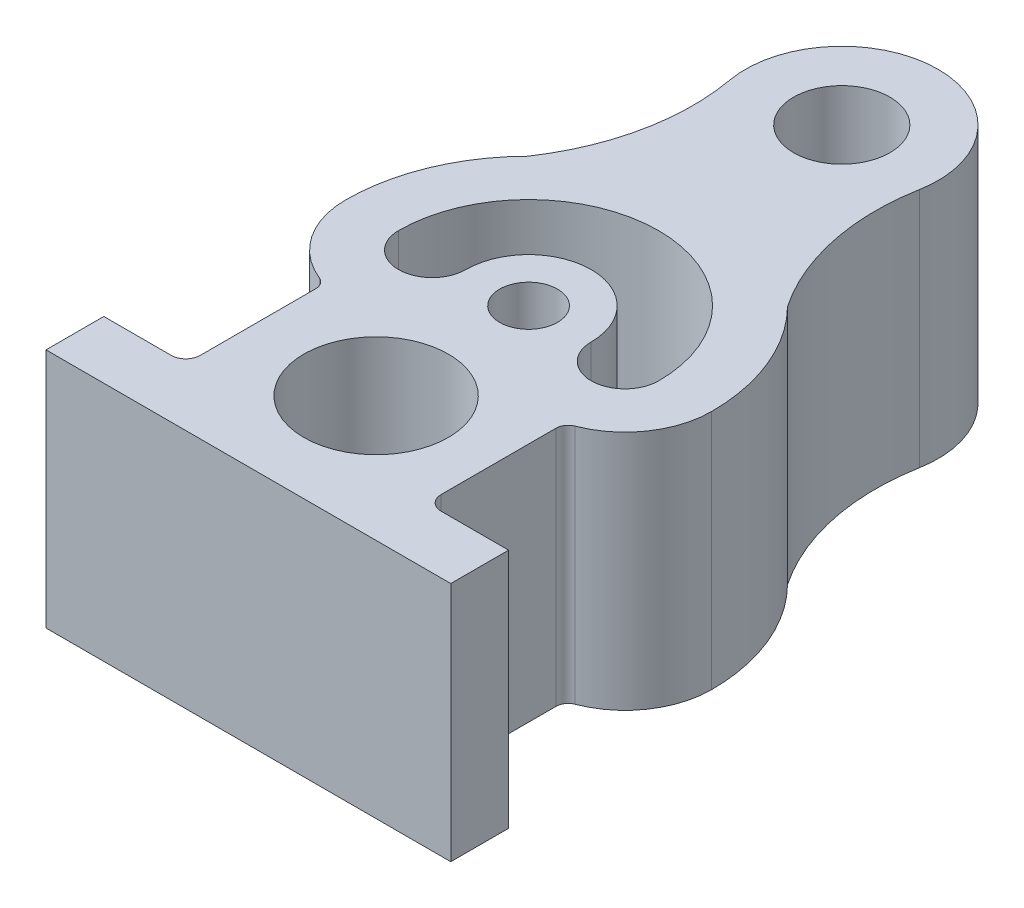
ISO-10303-21;
HEADER;
FILE_DESCRIPTION(('STEP AP214'),'2;1');
FILE_NAME('part.step','',(''),(''),'','','');
FILE_SCHEMA(('AUTOMOTIVE_DESIGN { 1 0 10303 214 1 1 1 1 }'));
ENDSEC;
DATA;
#1=APPLICATION_CONTEXT('core data for automotive mechanical design processes');
#2=APPLICATION_PROTOCOL_DEFINITION('international standard','automotive_design',2000,#1);
#3=PRODUCT_CONTEXT('',#1,'mechanical');
#4=PRODUCT('Part','Part','',(#3));
#5=PRODUCT_RELATED_PRODUCT_CATEGORY('part','',(#4));
#6=PRODUCT_DEFINITION_FORMATION('','',#4);
#7=PRODUCT_DEFINITION_CONTEXT('part definition',#1,'design');
#8=PRODUCT_DEFINITION('design','',#6,#7);
#9=PRODUCT_DEFINITION_SHAPE('','',#8);
#10=(LENGTH_UNIT() NAMED_UNIT(*) SI_UNIT(.MILLI.,.METRE.));
#11=(NAMED_UNIT(*) PLANE_ANGLE_UNIT() SI_UNIT($,.RADIAN.));
#12=(NAMED_UNIT(*) SI_UNIT($,.STERADIAN.) SOLID_ANGLE_UNIT());
#13=UNCERTAINTY_MEASURE_WITH_UNIT(LENGTH_MEASURE(1.E-05),#10,'distance_accuracy_value','');
#14=(GEOMETRIC_REPRESENTATION_CONTEXT(3) GLOBAL_UNCERTAINTY_ASSIGNED_CONTEXT((#13)) GLOBAL_UNIT_ASSIGNED_CONTEXT((#10,
#11,#12)) REPRESENTATION_CONTEXT('',''));
#15=CARTESIAN_POINT('',(0.,0.,0.));
#16=DIRECTION('',(0.,0.,1.));
#17=DIRECTION('',(1.,0.,0.));
#18=AXIS2_PLACEMENT_3D('',#15,#16,#17);
#19=CARTESIAN_POINT('',(0.,100.,0.));
#20=DIRECTION('',(0.,1.,0.));
#21=DIRECTION('',(0.,0.,1.));
#22=AXIS2_PLACEMENT_3D('',#19,#20,#21);
#23=PLANE('',#22);
#24=CARTESIAN_POINT('',(0.,100.,0.));
#25=DIRECTION('',(0.,1.,0.));
#26=DIRECTION('',(0.,0.,1.));
#27=AXIS2_PLACEMENT_3D('',#24,#25,#26);
#28=CIRCLE('',#27,12.);
#29=CARTESIAN_POINT('',(0.,100.,12.));
#30=VERTEX_POINT('',#29);
#31=EDGE_CURVE('E308',#30,#30,#28,.T.);
#32=ORIENTED_EDGE('',*,*,#31,.F.);
#33=EDGE_LOOP('',(#32));
#34=FACE_BOUND('',#33,.T.);
#35=CARTESIAN_POINT('',(-40.,100.,0.));
#36=DIRECTION('',(0.,1.,0.));
#37=DIRECTION('',(0.,0.,1.));
#38=AXIS2_PLACEMENT_3D('',#35,#36,#37);
#39=CIRCLE('',#38,14.);
#40=CARTESIAN_POINT('',(-54.,100.,0.));
#41=VERTEX_POINT('',#40);
#42=CARTESIAN_POINT('',(-26.,100.,0.));
#43=VERTEX_POINT('',#42);
#44=EDGE_CURVE('E201',#41,#43,#39,.T.);
#45=ORIENTED_EDGE('',*,*,#44,.F.);
#46=CARTESIAN_POINT('',(0.,100.,0.));
#47=DIRECTION('',(0.,1.,0.));
#48=DIRECTION('',(0.,0.,1.));
#49=AXIS2_PLACEMENT_3D('',#46,#47,#48);
#50=CIRCLE('',#49,54.);
#51=CARTESIAN_POINT('',(54.,100.,0.));
#52=VERTEX_POINT('',#51);
#53=EDGE_CURVE('E193',#52,#41,#50,.T.);
#54=ORIENTED_EDGE('',*,*,#53,.F.);
#55=CARTESIAN_POINT('',(40.,100.,0.));
#56=DIRECTION('',(0.,1.,0.));
#57=DIRECTION('',(0.,0.,1.));
#58=AXIS2_PLACEMENT_3D('',#55,#56,#57);
#59=CIRCLE('',#58,14.);
#60=CARTESIAN_POINT('',(26.,100.,0.));
#61=VERTEX_POINT('',#60);
#62=EDGE_CURVE('E220',#61,#52,#59,.T.);
#63=ORIENTED_EDGE('',*,*,#62,.F.);
#64=CARTESIAN_POINT('',(0.,100.,0.));
#65=DIRECTION('',(0.,-1.,0.));
#66=DIRECTION('',(0.,0.,1.));
#67=AXIS2_PLACEMENT_3D('',#64,#65,#66);
#68=CIRCLE('',#67,26.);
#69=EDGE_CURVE('E214',#43,#61,#68,.T.);
#70=ORIENTED_EDGE('',*,*,#69,.F.);
#71=EDGE_LOOP('',(#45,#54,#63,#70));
#72=FACE_BOUND('',#71,.T.);
#73=CARTESIAN_POINT('',(0.,100.,0.));
#74=DIRECTION('',(0.,1.,0.));
#75=DIRECTION('',(0.,0.,1.));
#76=AXIS2_PLACEMENT_3D('',#73,#74,#75);
#77=CIRCLE('',#76,76.);
#78=CARTESIAN_POINT('',(76.,100.,0.));
#79=VERTEX_POINT('',#78);
#80=CARTESIAN_POINT('',(54.,100.,-53.4789678284838));
#81=VERTEX_POINT('',#80);
#82=EDGE_CURVE('E838',#79,#81,#77,.T.);
#83=ORIENTED_EDGE('',*,*,#82,.T.);
#84=CARTESIAN_POINT('',(131.859787436224,100.,-106.146353375766));
#85=DIRECTION('',(0.,-1.,0.));
#86=DIRECTION('',(0.,0.,1.));
#87=AXIS2_PLACEMENT_3D('',#84,#85,#86);
#88=CIRCLE('',#87,94.0000000000001);
#89=CARTESIAN_POINT('',(39.3611305779773,100.,-122.879508470378));
#90=VERTEX_POINT('',#89);
#91=EDGE_CURVE('E586',#81,#90,#88,.T.);
#92=ORIENTED_EDGE('',*,*,#91,.T.);
#93=CARTESIAN_POINT('',(0.,100.,-130.));
#94=DIRECTION('',(0.,1.,0.));
#95=DIRECTION('',(0.,0.,1.));
#96=AXIS2_PLACEMENT_3D('',#93,#94,#95);
#97=CIRCLE('',#96,40.);
#98=CARTESIAN_POINT('',(-39.3611305779773,100.,-122.879508470378));
#99=VERTEX_POINT('',#98);
#100=EDGE_CURVE('E442',#90,#99,#97,.T.);
#101=ORIENTED_EDGE('',*,*,#100,.T.);
#102=CARTESIAN_POINT('',(-131.859787436224,100.,-106.146353375766));
#103=DIRECTION('',(0.,-1.,0.));
#104=DIRECTION('',(0.,0.,-1.));
#105=AXIS2_PLACEMENT_3D('',#102,#103,#104);
#106=CIRCLE('',#105,94.);
#107=CARTESIAN_POINT('',(-54.,100.,-53.4789678284838));
#108=VERTEX_POINT('',#107);
#109=EDGE_CURVE('E580',#99,#108,#106,.T.);
#110=ORIENTED_EDGE('',*,*,#109,.T.);
#111=CARTESIAN_POINT('',(0.,100.,0.));
#112=DIRECTION('',(0.,1.,0.));
#113=DIRECTION('',(0.,0.,1.));
#114=AXIS2_PLACEMENT_3D('',#111,#112,#113);
#115=CIRCLE('',#114,76.);
#116=CARTESIAN_POINT('',(-76.,100.,0.));
#117=VERTEX_POINT('',#116);
#118=EDGE_CURVE('E582',#108,#117,#115,.T.);
#119=ORIENTED_EDGE('',*,*,#118,.T.);
#120=CARTESIAN_POINT('',(-40.,100.,0.));
#121=DIRECTION('',(0.,1.,0.));
#122=DIRECTION('',(0.,0.,1.));
#123=AXIS2_PLACEMENT_3D('',#120,#121,#122);
#124=CIRCLE('',#123,36.);
#125=CARTESIAN_POINT('',(-53.4280868087204,100.,33.4018934292275));
#126=VERTEX_POINT('',#125);
#127=EDGE_CURVE('E584',#117,#126,#124,.T.);
#128=ORIENTED_EDGE('',*,*,#127,.T.);
#129=CARTESIAN_POINT('',(-55.2930988654871,100.,38.0410452943979));
#130=DIRECTION('',(0.,-1.,0.));
#131=DIRECTION('',(0.,0.,1.));
#132=AXIS2_PLACEMENT_3D('',#129,#130,#131);
#133=CIRCLE('',#132,5.);
#134=CARTESIAN_POINT('',(-50.2930988654871,100.,38.0410452943979));
#135=VERTEX_POINT('',#134);
#136=EDGE_CURVE('E606',#126,#135,#133,.T.);
#137=ORIENTED_EDGE('',*,*,#136,.T.);
#138=DIRECTION('',(0.,0.,1.));
#139=VECTOR('',#138,1.);
#140=CARTESIAN_POINT('',(-50.2930988654871,100.,86.));
#141=LINE('',#140,#139);
#142=CARTESIAN_POINT('',(-50.2930988654871,100.,86.));
#143=VERTEX_POINT('',#142);
#144=EDGE_CURVE('E616',#135,#143,#141,.T.);
#145=ORIENTED_EDGE('',*,*,#144,.T.);
#146=CARTESIAN_POINT('',(-56.2930988654871,100.,86.));
#147=DIRECTION('',(0.,-1.,0.));
#148=DIRECTION('',(0.,0.,1.));
#149=AXIS2_PLACEMENT_3D('',#146,#147,#148);
#150=CIRCLE('',#149,5.99999999999999);
#151=CARTESIAN_POINT('',(-56.2930988654871,100.,92.));
#152=VERTEX_POINT('',#151);
#153=EDGE_CURVE('E618',#143,#152,#150,.T.);
#154=ORIENTED_EDGE('',*,*,#153,.T.);
#155=DIRECTION('',(-1.,0.,0.));
#156=VECTOR('',#155,1.);
#157=CARTESIAN_POINT('',(-84.2930988654871,100.,92.));
#158=LINE('',#157,#156);
#159=CARTESIAN_POINT('',(-84.2930988654871,100.,92.));
#160=VERTEX_POINT('',#159);
#161=EDGE_CURVE('E627',#152,#160,#158,.T.);
#162=ORIENTED_EDGE('',*,*,#161,.T.);
#163=DIRECTION('',(0.,0.,1.));
#164=VECTOR('',#163,1.);
#165=CARTESIAN_POINT('',(-84.2930988654871,100.,116.));
#166=LINE('',#165,#164);
#167=CARTESIAN_POINT('',(-84.2930988654871,100.,116.));
#168=VERTEX_POINT('',#167);
#169=EDGE_CURVE('E631',#160,#168,#166,.T.);
#170=ORIENTED_EDGE('',*,*,#169,.T.);
#171=DIRECTION('',(1.,0.,0.));
#172=VECTOR('',#171,1.);
#173=CARTESIAN_POINT('',(-84.2930988654871,100.,116.));
#174=LINE('',#173,#172);
#175=CARTESIAN_POINT('',(83.7069011345129,100.,116.));
#176=VERTEX_POINT('',#175);
#177=EDGE_CURVE('E984',#168,#176,#174,.T.);
#178=ORIENTED_EDGE('',*,*,#177,.T.);
#179=DIRECTION('',(0.,0.,-1.));
#180=VECTOR('',#179,1.);
#181=CARTESIAN_POINT('',(83.7069011345129,100.,92.));
#182=LINE('',#181,#180);
#183=CARTESIAN_POINT('',(83.7069011345129,100.,92.));
#184=VERTEX_POINT('',#183);
#185=EDGE_CURVE('E645',#176,#184,#182,.T.);
#186=ORIENTED_EDGE('',*,*,#185,.T.);
#187=DIRECTION('',(-1.,0.,0.));
#188=VECTOR('',#187,1.);
#189=CARTESIAN_POINT('',(83.7069011345129,100.,92.));
#190=LINE('',#189,#188);
#191=CARTESIAN_POINT('',(55.7069011345129,100.,92.));
#192=VERTEX_POINT('',#191);
#193=EDGE_CURVE('E640',#184,#192,#190,.T.);
#194=ORIENTED_EDGE('',*,*,#193,.T.);
#195=CARTESIAN_POINT('',(55.7069011345129,100.,86.));
#196=DIRECTION('',(0.,-1.,0.));
#197=DIRECTION('',(0.,0.,1.));
#198=AXIS2_PLACEMENT_3D('',#195,#196,#197);
#199=CIRCLE('',#198,6.);
#200=CARTESIAN_POINT('',(49.7069011345129,100.,86.));
#201=VERTEX_POINT('',#200);
#202=EDGE_CURVE('E644',#192,#201,#199,.T.);
#203=ORIENTED_EDGE('',*,*,#202,.T.);
#204=DIRECTION('',(0.,0.,-1.));
#205=VECTOR('',#204,1.);
#206=CARTESIAN_POINT('',(49.7069011345129,100.,86.));
#207=LINE('',#206,#205);
#208=CARTESIAN_POINT('',(49.7069011345129,100.,38.2714914658374));
#209=VERTEX_POINT('',#208);
#210=EDGE_CURVE('E650',#201,#209,#207,.T.);
#211=ORIENTED_EDGE('',*,*,#210,.T.);
#212=CARTESIAN_POINT('',(54.7069011345129,100.,38.2714914658374));
#213=DIRECTION('',(0.,-1.,0.));
#214=DIRECTION('',(0.,0.,1.));
#215=AXIS2_PLACEMENT_3D('',#212,#213,#214);
#216=CIRCLE('',#215,5.);
#217=CARTESIAN_POINT('',(52.9133766059137,100.,33.604236409028));
#218=VERTEX_POINT('',#217);
#219=EDGE_CURVE('E659',#209,#218,#216,.T.);
#220=ORIENTED_EDGE('',*,*,#219,.T.);
#221=CARTESIAN_POINT('',(40.,100.,0.));
#222=DIRECTION('',(0.,1.,0.));
#223=DIRECTION('',(0.,0.,1.));
#224=AXIS2_PLACEMENT_3D('',#221,#222,#223);
#225=CIRCLE('',#224,36.);
#226=EDGE_CURVE('E661',#218,#79,#225,.T.);
#227=ORIENTED_EDGE('',*,*,#226,.T.);
#228=EDGE_LOOP('',(#83,#92,#101,#110,#119,#128,#137,#145,#154,#162,#170,#178,#186,#194,#203,
#211,#220,#227));
#229=FACE_BOUND('',#228,.T.);
#230=CARTESIAN_POINT('',(0.719405778018366,100.,64.));
#231=DIRECTION('',(0.,1.,0.));
#232=DIRECTION('',(0.,0.,1.));
#233=AXIS2_PLACEMENT_3D('',#230,#231,#232);
#234=CIRCLE('',#233,30.);
#235=CARTESIAN_POINT('',(0.719405778018366,100.,94.));
#236=VERTEX_POINT('',#235);
#237=EDGE_CURVE('E769',#236,#236,#234,.T.);
#238=ORIENTED_EDGE('',*,*,#237,.F.);
#239=EDGE_LOOP('',(#238));
#240=FACE_BOUND('',#239,.T.);
#241=CARTESIAN_POINT('',(0.,100.,-130.));
#242=DIRECTION('',(0.,1.,0.));
#243=DIRECTION('',(0.,0.,1.));
#244=AXIS2_PLACEMENT_3D('',#241,#242,#243);
#245=CIRCLE('',#244,20.);
#246=CARTESIAN_POINT('',(0.,100.,-110.));
#247=VERTEX_POINT('',#246);
#248=EDGE_CURVE('E326',#247,#247,#245,.T.);
#249=ORIENTED_EDGE('',*,*,#248,.F.);
#250=EDGE_LOOP('',(#249));
#251=FACE_BOUND('',#250,.T.);
#252=ADVANCED_FACE('F43',(#34,#72,#229,#240,#251),#23,.T.);
#253=CARTESIAN_POINT('',(0.,0.,0.));
#254=DIRECTION('',(0.,1.,0.));
#255=DIRECTION('',(0.,0.,1.));
#256=AXIS2_PLACEMENT_3D('',#253,#254,#255);
#257=PLANE('',#256);
#258=CARTESIAN_POINT('',(0.,0.,0.));
#259=DIRECTION('',(0.,1.,0.));
#260=DIRECTION('',(0.,0.,1.));
#261=AXIS2_PLACEMENT_3D('',#258,#259,#260);
#262=CIRCLE('',#261,76.);
#263=CARTESIAN_POINT('',(76.,0.,0.));
#264=VERTEX_POINT('',#263);
#265=CARTESIAN_POINT('',(54.,0.,-53.4789678284838));
#266=VERTEX_POINT('',#265);
#267=EDGE_CURVE('E209',#264,#266,#262,.T.);
#268=ORIENTED_EDGE('',*,*,#267,.F.);
#269=CARTESIAN_POINT('',(40.,0.,0.));
#270=DIRECTION('',(0.,1.,0.));
#271=DIRECTION('',(0.,0.,1.));
#272=AXIS2_PLACEMENT_3D('',#269,#270,#271);
#273=CIRCLE('',#272,36.);
#274=CARTESIAN_POINT('',(52.9133766059137,0.,33.604236409028));
#275=VERTEX_POINT('',#274);
#276=EDGE_CURVE('E834',#275,#264,#273,.T.);
#277=ORIENTED_EDGE('',*,*,#276,.F.);
#278=CARTESIAN_POINT('',(54.7069011345129,0.,38.2714914658374));
#279=DIRECTION('',(0.,-1.,0.));
#280=DIRECTION('',(0.,0.,1.));
#281=AXIS2_PLACEMENT_3D('',#278,#279,#280);
#282=CIRCLE('',#281,5.);
#283=CARTESIAN_POINT('',(49.7069011345129,0.,38.2714914658374));
#284=VERTEX_POINT('',#283);
#285=EDGE_CURVE('E839',#284,#275,#282,.T.);
#286=ORIENTED_EDGE('',*,*,#285,.F.);
#287=DIRECTION('',(0.,0.,-1.));
#288=VECTOR('',#287,1.);
#289=CARTESIAN_POINT('',(49.7069011345129,0.,86.));
#290=LINE('',#289,#288);
#291=CARTESIAN_POINT('',(49.7069011345129,0.,86.));
#292=VERTEX_POINT('',#291);
#293=EDGE_CURVE('E1167',#292,#284,#290,.T.);
#294=ORIENTED_EDGE('',*,*,#293,.F.);
#295=CARTESIAN_POINT('',(55.7069011345129,0.,86.));
#296=DIRECTION('',(0.,-1.,0.));
#297=DIRECTION('',(0.,0.,1.));
#298=AXIS2_PLACEMENT_3D('',#295,#296,#297);
#299=CIRCLE('',#298,6.);
#300=CARTESIAN_POINT('',(55.7069011345129,0.,92.));
#301=VERTEX_POINT('',#300);
#302=EDGE_CURVE('E294',#301,#292,#299,.T.);
#303=ORIENTED_EDGE('',*,*,#302,.F.);
#304=DIRECTION('',(-1.,0.,0.));
#305=VECTOR('',#304,1.);
#306=CARTESIAN_POINT('',(83.7069011345129,0.,92.));
#307=LINE('',#306,#305);
#308=CARTESIAN_POINT('',(83.7069011345129,0.,92.));
#309=VERTEX_POINT('',#308);
#310=EDGE_CURVE('E289',#309,#301,#307,.T.);
#311=ORIENTED_EDGE('',*,*,#310,.F.);
#312=DIRECTION('',(0.,0.,-1.));
#313=VECTOR('',#312,1.);
#314=CARTESIAN_POINT('',(83.7069011345129,0.,92.));
#315=LINE('',#314,#313);
#316=CARTESIAN_POINT('',(83.7069011345129,0.,116.));
#317=VERTEX_POINT('',#316);
#318=EDGE_CURVE('E295',#317,#309,#315,.T.);
#319=ORIENTED_EDGE('',*,*,#318,.F.);
#320=DIRECTION('',(1.,0.,0.));
#321=VECTOR('',#320,1.);
#322=CARTESIAN_POINT('',(-84.2930988654871,0.,116.));
#323=LINE('',#322,#321);
#324=CARTESIAN_POINT('',(-84.2930988654871,0.,116.));
#325=VERTEX_POINT('',#324);
#326=EDGE_CURVE('E1109',#325,#317,#323,.T.);
#327=ORIENTED_EDGE('',*,*,#326,.F.);
#328=DIRECTION('',(0.,0.,1.));
#329=VECTOR('',#328,1.);
#330=CARTESIAN_POINT('',(-84.2930988654871,0.,116.));
#331=LINE('',#330,#329);
#332=CARTESIAN_POINT('',(-84.2930988654871,0.,92.));
#333=VERTEX_POINT('',#332);
#334=EDGE_CURVE('E256',#333,#325,#331,.T.);
#335=ORIENTED_EDGE('',*,*,#334,.F.);
#336=DIRECTION('',(-1.,0.,0.));
#337=VECTOR('',#336,1.);
#338=CARTESIAN_POINT('',(-84.2930988654871,0.,92.));
#339=LINE('',#338,#337);
#340=CARTESIAN_POINT('',(-56.2930988654871,0.,92.));
#341=VERTEX_POINT('',#340);
#342=EDGE_CURVE('E251',#341,#333,#339,.T.);
#343=ORIENTED_EDGE('',*,*,#342,.F.);
#344=CARTESIAN_POINT('',(-56.2930988654871,0.,86.));
#345=DIRECTION('',(0.,-1.,0.));
#346=DIRECTION('',(0.,0.,1.));
#347=AXIS2_PLACEMENT_3D('',#344,#345,#346);
#348=CIRCLE('',#347,5.99999999999999);
#349=CARTESIAN_POINT('',(-50.2930988654871,0.,86.));
#350=VERTEX_POINT('',#349);
#351=EDGE_CURVE('E257',#350,#341,#348,.T.);
#352=ORIENTED_EDGE('',*,*,#351,.F.);
#353=DIRECTION('',(0.,0.,1.));
#354=VECTOR('',#353,1.);
#355=CARTESIAN_POINT('',(-50.2930988654871,0.,86.));
#356=LINE('',#355,#354);
#357=CARTESIAN_POINT('',(-50.2930988654871,0.,38.0410452943979));
#358=VERTEX_POINT('',#357);
#359=EDGE_CURVE('E276',#358,#350,#356,.T.);
#360=ORIENTED_EDGE('',*,*,#359,.F.);
#361=CARTESIAN_POINT('',(-55.2930988654871,0.,38.0410452943979));
#362=DIRECTION('',(0.,-1.,0.));
#363=DIRECTION('',(0.,0.,1.));
#364=AXIS2_PLACEMENT_3D('',#361,#362,#363);
#365=CIRCLE('',#364,5.);
#366=CARTESIAN_POINT('',(-53.4280868087204,0.,33.4018934292275));
#367=VERTEX_POINT('',#366);
#368=EDGE_CURVE('E273',#367,#358,#365,.T.);
#369=ORIENTED_EDGE('',*,*,#368,.F.);
#370=CARTESIAN_POINT('',(-40.,0.,0.));
#371=DIRECTION('',(0.,1.,0.));
#372=DIRECTION('',(0.,0.,1.));
#373=AXIS2_PLACEMENT_3D('',#370,#371,#372);
#374=CIRCLE('',#373,36.);
#375=CARTESIAN_POINT('',(-76.,0.,0.));
#376=VERTEX_POINT('',#375);
#377=EDGE_CURVE('E277',#376,#367,#374,.T.);
#378=ORIENTED_EDGE('',*,*,#377,.F.);
#379=CARTESIAN_POINT('',(0.,0.,0.));
#380=DIRECTION('',(0.,1.,0.));
#381=DIRECTION('',(0.,0.,1.));
#382=AXIS2_PLACEMENT_3D('',#379,#380,#381);
#383=CIRCLE('',#382,76.);
#384=CARTESIAN_POINT('',(-54.,0.,-53.4789678284838));
#385=VERTEX_POINT('',#384);
#386=EDGE_CURVE('E449',#385,#376,#383,.T.);
#387=ORIENTED_EDGE('',*,*,#386,.F.);
#388=CARTESIAN_POINT('',(-131.859787436224,0.,-106.146353375766));
#389=DIRECTION('',(0.,-1.,0.));
#390=DIRECTION('',(0.,0.,-1.));
#391=AXIS2_PLACEMENT_3D('',#388,#389,#390);
#392=CIRCLE('',#391,94.);
#393=CARTESIAN_POINT('',(-39.3611305779773,0.,-122.879508470378));
#394=VERTEX_POINT('',#393);
#395=EDGE_CURVE('E447',#394,#385,#392,.T.);
#396=ORIENTED_EDGE('',*,*,#395,.F.);
#397=CARTESIAN_POINT('',(0.,0.,-130.));
#398=DIRECTION('',(0.,1.,0.));
#399=DIRECTION('',(0.,0.,1.));
#400=AXIS2_PLACEMENT_3D('',#397,#398,#399);
#401=CIRCLE('',#400,40.);
#402=CARTESIAN_POINT('',(39.3611305779773,0.,-122.879508470378));
#403=VERTEX_POINT('',#402);
#404=EDGE_CURVE('E438',#403,#394,#401,.T.);
#405=ORIENTED_EDGE('',*,*,#404,.F.);
#406=CARTESIAN_POINT('',(131.859787436224,0.,-106.146353375766));
#407=DIRECTION('',(0.,-1.,0.));
#408=DIRECTION('',(0.,0.,1.));
#409=AXIS2_PLACEMENT_3D('',#406,#407,#408);
#410=CIRCLE('',#409,94.0000000000001);
#411=EDGE_CURVE('E431',#266,#403,#410,.T.);
#412=ORIENTED_EDGE('',*,*,#411,.F.);
#413=EDGE_LOOP('',(#268,#277,#286,#294,#303,#311,#319,#327,#335,#343,#352,#360,#369,#378,#387,
#396,#405,#412));
#414=FACE_BOUND('',#413,.T.);
#415=CARTESIAN_POINT('',(0.,0.,0.));
#416=DIRECTION('',(0.,1.,0.));
#417=DIRECTION('',(0.,0.,1.));
#418=AXIS2_PLACEMENT_3D('',#415,#416,#417);
#419=CIRCLE('',#418,54.);
#420=CARTESIAN_POINT('',(54.,0.,0.));
#421=VERTEX_POINT('',#420);
#422=CARTESIAN_POINT('',(-54.,0.,0.));
#423=VERTEX_POINT('',#422);
#424=EDGE_CURVE('E67',#421,#423,#419,.T.);
#425=ORIENTED_EDGE('',*,*,#424,.T.);
#426=CARTESIAN_POINT('',(-40.,0.,0.));
#427=DIRECTION('',(0.,1.,0.));
#428=DIRECTION('',(0.,0.,1.));
#429=AXIS2_PLACEMENT_3D('',#426,#427,#428);
#430=CIRCLE('',#429,14.);
#431=CARTESIAN_POINT('',(-26.,0.,0.));
#432=VERTEX_POINT('',#431);
#433=EDGE_CURVE('E208',#423,#432,#430,.T.);
#434=ORIENTED_EDGE('',*,*,#433,.T.);
#435=CARTESIAN_POINT('',(0.,0.,0.));
#436=DIRECTION('',(0.,-1.,0.));
#437=DIRECTION('',(0.,0.,1.));
#438=AXIS2_PLACEMENT_3D('',#435,#436,#437);
#439=CIRCLE('',#438,26.);
#440=CARTESIAN_POINT('',(26.,0.,0.));
#441=VERTEX_POINT('',#440);
#442=EDGE_CURVE('E781',#432,#441,#439,.T.);
#443=ORIENTED_EDGE('',*,*,#442,.T.);
#444=CARTESIAN_POINT('',(40.,0.,0.));
#445=DIRECTION('',(0.,1.,0.));
#446=DIRECTION('',(0.,0.,1.));
#447=AXIS2_PLACEMENT_3D('',#444,#445,#446);
#448=CIRCLE('',#447,14.);
#449=EDGE_CURVE('E202',#441,#421,#448,.T.);
#450=ORIENTED_EDGE('',*,*,#449,.T.);
#451=EDGE_LOOP('',(#425,#434,#443,#450));
#452=FACE_BOUND('',#451,.T.);
#453=CARTESIAN_POINT('',(0.719405778018366,0.,64.));
#454=DIRECTION('',(0.,1.,0.));
#455=DIRECTION('',(0.,0.,1.));
#456=AXIS2_PLACEMENT_3D('',#453,#454,#455);
#457=CIRCLE('',#456,30.);
#458=CARTESIAN_POINT('',(0.719405778018366,0.,94.));
#459=VERTEX_POINT('',#458);
#460=EDGE_CURVE('E313',#459,#459,#457,.T.);
#461=ORIENTED_EDGE('',*,*,#460,.T.);
#462=EDGE_LOOP('',(#461));
#463=FACE_BOUND('',#462,.T.);
#464=CARTESIAN_POINT('',(0.,0.,0.));
#465=DIRECTION('',(0.,1.,0.));
#466=DIRECTION('',(0.,0.,1.));
#467=AXIS2_PLACEMENT_3D('',#464,#465,#466);
#468=CIRCLE('',#467,12.);
#469=CARTESIAN_POINT('',(0.,0.,12.));
#470=VERTEX_POINT('',#469);
#471=EDGE_CURVE('E314',#470,#470,#468,.T.);
#472=ORIENTED_EDGE('',*,*,#471,.T.);
#473=EDGE_LOOP('',(#472));
#474=FACE_BOUND('',#473,.T.);
#475=CARTESIAN_POINT('',(0.,0.,-130.));
#476=DIRECTION('',(0.,1.,0.));
#477=DIRECTION('',(0.,0.,1.));
#478=AXIS2_PLACEMENT_3D('',#475,#476,#477);
#479=CIRCLE('',#478,20.);
#480=CARTESIAN_POINT('',(0.,0.,-110.));
#481=VERTEX_POINT('',#480);
#482=EDGE_CURVE('E315',#481,#481,#479,.T.);
#483=ORIENTED_EDGE('',*,*,#482,.T.);
#484=EDGE_LOOP('',(#483));
#485=FACE_BOUND('',#484,.T.);
#486=ADVANCED_FACE('F336',(#414,#452,#463,#474,#485),#257,.F.);
#487=CARTESIAN_POINT('',(0.,100.,0.));
#488=DIRECTION('',(0.,-1.,0.));
#489=DIRECTION('',(0.,0.,-1.));
#490=AXIS2_PLACEMENT_3D('',#487,#488,#489);
#491=CYLINDRICAL_SURFACE('',#490,76.);
#492=ORIENTED_EDGE('',*,*,#267,.T.);
#493=DIRECTION('',(0.,-1.,0.));
#494=VECTOR('',#493,1.);
#495=CARTESIAN_POINT('',(54.,100.,-53.4789678284838));
#496=LINE('',#495,#494);
#497=EDGE_CURVE('E12',#81,#266,#496,.T.);
#498=ORIENTED_EDGE('',*,*,#497,.F.);
#499=ORIENTED_EDGE('',*,*,#82,.F.);
#500=DIRECTION('',(0.,-1.,0.));
#501=VECTOR('',#500,1.);
#502=CARTESIAN_POINT('',(76.,100.,0.));
#503=LINE('',#502,#501);
#504=EDGE_CURVE('E841',#79,#264,#503,.T.);
#505=ORIENTED_EDGE('',*,*,#504,.T.);
#506=EDGE_LOOP('',(#492,#498,#499,#505));
#507=FACE_BOUND('',#506,.T.);
#508=ADVANCED_FACE('F45',(#507),#491,.T.);
#509=CARTESIAN_POINT('',(131.859787436224,100.,-106.146353375766));
#510=DIRECTION('',(0.,-1.,0.));
#511=DIRECTION('',(0.,0.,-1.));
#512=AXIS2_PLACEMENT_3D('',#509,#510,#511);
#513=CYLINDRICAL_SURFACE('',#512,94.0000000000001);
#514=ORIENTED_EDGE('',*,*,#411,.T.);
#515=DIRECTION('',(0.,-1.,0.));
#516=VECTOR('',#515,1.);
#517=CARTESIAN_POINT('',(39.3611305779773,100.,-122.879508470378));
#518=LINE('',#517,#516);
#519=EDGE_CURVE('E52',#90,#403,#518,.T.);
#520=ORIENTED_EDGE('',*,*,#519,.F.);
#521=ORIENTED_EDGE('',*,*,#91,.F.);
#522=ORIENTED_EDGE('',*,*,#497,.T.);
#523=EDGE_LOOP('',(#514,#520,#521,#522));
#524=FACE_BOUND('',#523,.T.);
#525=ADVANCED_FACE('F422',(#524),#513,.F.);
#526=CARTESIAN_POINT('',(0.,100.,-130.));
#527=DIRECTION('',(0.,-1.,0.));
#528=DIRECTION('',(0.,0.,-1.));
#529=AXIS2_PLACEMENT_3D('',#526,#527,#528);
#530=CYLINDRICAL_SURFACE('',#529,40.);
#531=ORIENTED_EDGE('',*,*,#404,.T.);
#532=DIRECTION('',(0.,-1.,0.));
#533=VECTOR('',#532,1.);
#534=CARTESIAN_POINT('',(-39.3611305779773,100.,-122.879508470378));
#535=LINE('',#534,#533);
#536=EDGE_CURVE('E443',#99,#394,#535,.T.);
#537=ORIENTED_EDGE('',*,*,#536,.F.);
#538=ORIENTED_EDGE('',*,*,#100,.F.);
#539=ORIENTED_EDGE('',*,*,#519,.T.);
#540=EDGE_LOOP('',(#531,#537,#538,#539));
#541=FACE_BOUND('',#540,.T.);
#542=ADVANCED_FACE('F419',(#541),#530,.T.);
#543=CARTESIAN_POINT('',(-131.859787436224,100.,-106.146353375766));
#544=DIRECTION('',(0.,-1.,0.));
#545=DIRECTION('',(0.,0.,-1.));
#546=AXIS2_PLACEMENT_3D('',#543,#544,#545);
#547=CYLINDRICAL_SURFACE('',#546,94.);
#548=ORIENTED_EDGE('',*,*,#395,.T.);
#549=DIRECTION('',(0.,-1.,0.));
#550=VECTOR('',#549,1.);
#551=CARTESIAN_POINT('',(-54.,100.,-53.4789678284838));
#552=LINE('',#551,#550);
#553=EDGE_CURVE('E570',#108,#385,#552,.T.);
#554=ORIENTED_EDGE('',*,*,#553,.F.);
#555=ORIENTED_EDGE('',*,*,#109,.F.);
#556=ORIENTED_EDGE('',*,*,#536,.T.);
#557=EDGE_LOOP('',(#548,#554,#555,#556));
#558=FACE_BOUND('',#557,.T.);
#559=ADVANCED_FACE('F415',(#558),#547,.F.);
#560=CARTESIAN_POINT('',(0.,100.,0.));
#561=DIRECTION('',(0.,-1.,0.));
#562=DIRECTION('',(0.,0.,-1.));
#563=AXIS2_PLACEMENT_3D('',#560,#561,#562);
#564=CYLINDRICAL_SURFACE('',#563,76.);
#565=ORIENTED_EDGE('',*,*,#386,.T.);
#566=DIRECTION('',(0.,-1.,0.));
#567=VECTOR('',#566,1.);
#568=CARTESIAN_POINT('',(-76.,100.,0.));
#569=LINE('',#568,#567);
#570=EDGE_CURVE('E575',#117,#376,#569,.T.);
#571=ORIENTED_EDGE('',*,*,#570,.F.);
#572=ORIENTED_EDGE('',*,*,#118,.F.);
#573=ORIENTED_EDGE('',*,*,#553,.T.);
#574=EDGE_LOOP('',(#565,#571,#572,#573));
#575=FACE_BOUND('',#574,.T.);
#576=ADVANCED_FACE('F411',(#575),#564,.T.);
#577=CARTESIAN_POINT('',(-40.,100.,0.));
#578=DIRECTION('',(0.,-1.,0.));
#579=DIRECTION('',(0.,0.,-1.));
#580=AXIS2_PLACEMENT_3D('',#577,#578,#579);
#581=CYLINDRICAL_SURFACE('',#580,36.);
#582=ORIENTED_EDGE('',*,*,#377,.T.);
#583=DIRECTION('',(0.,-1.,0.));
#584=VECTOR('',#583,1.);
#585=CARTESIAN_POINT('',(-53.4280868087204,100.,33.4018934292275));
#586=LINE('',#585,#584);
#587=EDGE_CURVE('E823',#126,#367,#586,.T.);
#588=ORIENTED_EDGE('',*,*,#587,.F.);
#589=ORIENTED_EDGE('',*,*,#127,.F.);
#590=ORIENTED_EDGE('',*,*,#570,.T.);
#591=EDGE_LOOP('',(#582,#588,#589,#590));
#592=FACE_BOUND('',#591,.T.);
#593=ADVANCED_FACE('F407',(#592),#581,.T.);
#594=CARTESIAN_POINT('',(-55.2930988654871,100.,38.0410452943979));
#595=DIRECTION('',(0.,-1.,0.));
#596=DIRECTION('',(0.,0.,-1.));
#597=AXIS2_PLACEMENT_3D('',#594,#595,#596);
#598=CYLINDRICAL_SURFACE('',#597,5.);
#599=ORIENTED_EDGE('',*,*,#368,.T.);
#600=DIRECTION('',(0.,-1.,0.));
#601=VECTOR('',#600,1.);
#602=CARTESIAN_POINT('',(-50.2930988654871,100.,38.0410452943979));
#603=LINE('',#602,#601);
#604=EDGE_CURVE('E820',#135,#358,#603,.T.);
#605=ORIENTED_EDGE('',*,*,#604,.F.);
#606=ORIENTED_EDGE('',*,*,#136,.F.);
#607=ORIENTED_EDGE('',*,*,#587,.T.);
#608=EDGE_LOOP('',(#599,#605,#606,#607));
#609=FACE_BOUND('',#608,.T.);
#610=ADVANCED_FACE('F403',(#609),#598,.F.);
#611=CARTESIAN_POINT('',(-50.2930988654871,100.,86.));
#612=DIRECTION('',(1.,0.,0.));
#613=DIRECTION('',(0.,0.,-1.));
#614=AXIS2_PLACEMENT_3D('',#611,#612,#613);
#615=PLANE('',#614);
#616=ORIENTED_EDGE('',*,*,#359,.T.);
#617=DIRECTION('',(0.,-1.,0.));
#618=VECTOR('',#617,1.);
#619=CARTESIAN_POINT('',(-50.2930988654871,100.,86.));
#620=LINE('',#619,#618);
#621=EDGE_CURVE('E810',#143,#350,#620,.T.);
#622=ORIENTED_EDGE('',*,*,#621,.F.);
#623=ORIENTED_EDGE('',*,*,#144,.F.);
#624=ORIENTED_EDGE('',*,*,#604,.T.);
#625=EDGE_LOOP('',(#616,#622,#623,#624));
#626=FACE_BOUND('',#625,.T.);
#627=ADVANCED_FACE('F399',(#626),#615,.F.);
#628=CARTESIAN_POINT('',(-56.2930988654871,100.,86.));
#629=DIRECTION('',(0.,-1.,0.));
#630=DIRECTION('',(0.,0.,-1.));
#631=AXIS2_PLACEMENT_3D('',#628,#629,#630);
#632=CYLINDRICAL_SURFACE('',#631,5.99999999999999);
#633=ORIENTED_EDGE('',*,*,#351,.T.);
#634=DIRECTION('',(0.,-1.,0.));
#635=VECTOR('',#634,1.);
#636=CARTESIAN_POINT('',(-56.2930988654871,100.,92.));
#637=LINE('',#636,#635);
#638=EDGE_CURVE('E807',#152,#341,#637,.T.);
#639=ORIENTED_EDGE('',*,*,#638,.F.);
#640=ORIENTED_EDGE('',*,*,#153,.F.);
#641=ORIENTED_EDGE('',*,*,#621,.T.);
#642=EDGE_LOOP('',(#633,#639,#640,#641));
#643=FACE_BOUND('',#642,.T.);
#644=ADVANCED_FACE('F395',(#643),#632,.F.);
#645=CARTESIAN_POINT('',(-84.2930988654871,100.,92.));
#646=DIRECTION('',(0.,0.,1.));
#647=DIRECTION('',(1.,0.,0.));
#648=AXIS2_PLACEMENT_3D('',#645,#646,#647);
#649=PLANE('',#648);
#650=ORIENTED_EDGE('',*,*,#342,.T.);
#651=DIRECTION('',(0.,-1.,0.));
#652=VECTOR('',#651,1.);
#653=CARTESIAN_POINT('',(-84.2930988654871,100.,92.));
#654=LINE('',#653,#652);
#655=EDGE_CURVE('E811',#160,#333,#654,.T.);
#656=ORIENTED_EDGE('',*,*,#655,.F.);
#657=ORIENTED_EDGE('',*,*,#161,.F.);
#658=ORIENTED_EDGE('',*,*,#638,.T.);
#659=EDGE_LOOP('',(#650,#656,#657,#658));
#660=FACE_BOUND('',#659,.T.);
#661=ADVANCED_FACE('F391',(#660),#649,.F.);
#662=CARTESIAN_POINT('',(-84.2930988654871,100.,116.));
#663=DIRECTION('',(1.,0.,0.));
#664=DIRECTION('',(0.,0.,-1.));
#665=AXIS2_PLACEMENT_3D('',#662,#663,#664);
#666=PLANE('',#665);
#667=ORIENTED_EDGE('',*,*,#334,.T.);
#668=DIRECTION('',(0.,-1.,0.));
#669=VECTOR('',#668,1.);
#670=CARTESIAN_POINT('',(-84.2930988654871,100.,116.));
#671=LINE('',#670,#669);
#672=EDGE_CURVE('E865',#168,#325,#671,.T.);
#673=ORIENTED_EDGE('',*,*,#672,.F.);
#674=ORIENTED_EDGE('',*,*,#169,.F.);
#675=ORIENTED_EDGE('',*,*,#655,.T.);
#676=EDGE_LOOP('',(#667,#673,#674,#675));
#677=FACE_BOUND('',#676,.T.);
#678=ADVANCED_FACE('F387',(#677),#666,.F.);
#679=CARTESIAN_POINT('',(-84.2930988654871,100.,116.));
#680=DIRECTION('',(0.,0.,-1.));
#681=DIRECTION('',(-1.,0.,0.));
#682=AXIS2_PLACEMENT_3D('',#679,#680,#681);
#683=PLANE('',#682);
#684=ORIENTED_EDGE('',*,*,#326,.T.);
#685=DIRECTION('',(0.,-1.,0.));
#686=VECTOR('',#685,1.);
#687=CARTESIAN_POINT('',(83.7069011345129,100.,116.));
#688=LINE('',#687,#686);
#689=EDGE_CURVE('E860',#176,#317,#688,.T.);
#690=ORIENTED_EDGE('',*,*,#689,.F.);
#691=ORIENTED_EDGE('',*,*,#177,.F.);
#692=ORIENTED_EDGE('',*,*,#672,.T.);
#693=EDGE_LOOP('',(#684,#690,#691,#692));
#694=FACE_BOUND('',#693,.T.);
#695=ADVANCED_FACE('F383',(#694),#683,.F.);
#696=CARTESIAN_POINT('',(83.7069011345129,100.,92.));
#697=DIRECTION('',(-1.,0.,0.));
#698=DIRECTION('',(0.,0.,1.));
#699=AXIS2_PLACEMENT_3D('',#696,#697,#698);
#700=PLANE('',#699);
#701=ORIENTED_EDGE('',*,*,#318,.T.);
#702=DIRECTION('',(0.,-1.,0.));
#703=VECTOR('',#702,1.);
#704=CARTESIAN_POINT('',(83.7069011345129,100.,92.));
#705=LINE('',#704,#703);
#706=EDGE_CURVE('E854',#184,#309,#705,.T.);
#707=ORIENTED_EDGE('',*,*,#706,.F.);
#708=ORIENTED_EDGE('',*,*,#185,.F.);
#709=ORIENTED_EDGE('',*,*,#689,.T.);
#710=EDGE_LOOP('',(#701,#707,#708,#709));
#711=FACE_BOUND('',#710,.T.);
#712=ADVANCED_FACE('F379',(#711),#700,.F.);
#713=CARTESIAN_POINT('',(83.7069011345129,100.,92.));
#714=DIRECTION('',(0.,0.,1.));
#715=DIRECTION('',(1.,0.,0.));
#716=AXIS2_PLACEMENT_3D('',#713,#714,#715);
#717=PLANE('',#716);
#718=ORIENTED_EDGE('',*,*,#310,.T.);
#719=DIRECTION('',(0.,-1.,0.));
#720=VECTOR('',#719,1.);
#721=CARTESIAN_POINT('',(55.7069011345129,100.,92.));
#722=LINE('',#721,#720);
#723=EDGE_CURVE('E850',#192,#301,#722,.T.);
#724=ORIENTED_EDGE('',*,*,#723,.F.);
#725=ORIENTED_EDGE('',*,*,#193,.F.);
#726=ORIENTED_EDGE('',*,*,#706,.T.);
#727=EDGE_LOOP('',(#718,#724,#725,#726));
#728=FACE_BOUND('',#727,.T.);
#729=ADVANCED_FACE('F375',(#728),#717,.F.);
#730=CARTESIAN_POINT('',(55.7069011345129,100.,86.));
#731=DIRECTION('',(0.,-1.,0.));
#732=DIRECTION('',(0.,0.,-1.));
#733=AXIS2_PLACEMENT_3D('',#730,#731,#732);
#734=CYLINDRICAL_SURFACE('',#733,6.);
#735=ORIENTED_EDGE('',*,*,#302,.T.);
#736=DIRECTION('',(0.,-1.,0.));
#737=VECTOR('',#736,1.);
#738=CARTESIAN_POINT('',(49.7069011345129,100.,86.));
#739=LINE('',#738,#737);
#740=EDGE_CURVE('E855',#201,#292,#739,.T.);
#741=ORIENTED_EDGE('',*,*,#740,.F.);
#742=ORIENTED_EDGE('',*,*,#202,.F.);
#743=ORIENTED_EDGE('',*,*,#723,.T.);
#744=EDGE_LOOP('',(#735,#741,#742,#743));
#745=FACE_BOUND('',#744,.T.);
#746=ADVANCED_FACE('F371',(#745),#734,.F.);
#747=CARTESIAN_POINT('',(49.7069011345129,100.,86.));
#748=DIRECTION('',(-1.,0.,0.));
#749=DIRECTION('',(0.,0.,1.));
#750=AXIS2_PLACEMENT_3D('',#747,#748,#749);
#751=PLANE('',#750);
#752=ORIENTED_EDGE('',*,*,#293,.T.);
#753=DIRECTION('',(0.,-1.,0.));
#754=VECTOR('',#753,1.);
#755=CARTESIAN_POINT('',(49.7069011345129,100.,38.2714914658374));
#756=LINE('',#755,#754);
#757=EDGE_CURVE('E1121',#209,#284,#756,.T.);
#758=ORIENTED_EDGE('',*,*,#757,.F.);
#759=ORIENTED_EDGE('',*,*,#210,.F.);
#760=ORIENTED_EDGE('',*,*,#740,.T.);
#761=EDGE_LOOP('',(#752,#758,#759,#760));
#762=FACE_BOUND('',#761,.T.);
#763=ADVANCED_FACE('F367',(#762),#751,.F.);
#764=CARTESIAN_POINT('',(54.7069011345129,100.,38.2714914658374));
#765=DIRECTION('',(0.,-1.,0.));
#766=DIRECTION('',(0.,0.,-1.));
#767=AXIS2_PLACEMENT_3D('',#764,#765,#766);
#768=CYLINDRICAL_SURFACE('',#767,5.);
#769=ORIENTED_EDGE('',*,*,#285,.T.);
#770=DIRECTION('',(0.,-1.,0.));
#771=VECTOR('',#770,1.);
#772=CARTESIAN_POINT('',(52.9133766059137,100.,33.604236409028));
#773=LINE('',#772,#771);
#774=EDGE_CURVE('E1129',#218,#275,#773,.T.);
#775=ORIENTED_EDGE('',*,*,#774,.F.);
#776=ORIENTED_EDGE('',*,*,#219,.F.);
#777=ORIENTED_EDGE('',*,*,#757,.T.);
#778=EDGE_LOOP('',(#769,#775,#776,#777));
#779=FACE_BOUND('',#778,.T.);
#780=ADVANCED_FACE('F363',(#779),#768,.F.);
#781=CARTESIAN_POINT('',(40.,100.,0.));
#782=DIRECTION('',(0.,-1.,0.));
#783=DIRECTION('',(0.,0.,-1.));
#784=AXIS2_PLACEMENT_3D('',#781,#782,#783);
#785=CYLINDRICAL_SURFACE('',#784,36.);
#786=ORIENTED_EDGE('',*,*,#276,.T.);
#787=ORIENTED_EDGE('',*,*,#504,.F.);
#788=ORIENTED_EDGE('',*,*,#226,.F.);
#789=ORIENTED_EDGE('',*,*,#774,.T.);
#790=EDGE_LOOP('',(#786,#787,#788,#789));
#791=FACE_BOUND('',#790,.T.);
#792=ADVANCED_FACE('F360',(#791),#785,.T.);
#793=CARTESIAN_POINT('',(0.,100.,0.));
#794=DIRECTION('',(0.,-1.,0.));
#795=DIRECTION('',(0.,0.,-1.));
#796=AXIS2_PLACEMENT_3D('',#793,#794,#795);
#797=CYLINDRICAL_SURFACE('',#796,54.);
#798=ORIENTED_EDGE('',*,*,#424,.F.);
#799=DIRECTION('',(0.,-1.,0.));
#800=VECTOR('',#799,1.);
#801=CARTESIAN_POINT('',(54.,100.,0.));
#802=LINE('',#801,#800);
#803=EDGE_CURVE('E197',#52,#421,#802,.T.);
#804=ORIENTED_EDGE('',*,*,#803,.F.);
#805=ORIENTED_EDGE('',*,*,#53,.T.);
#806=DIRECTION('',(0.,-1.,0.));
#807=VECTOR('',#806,1.);
#808=CARTESIAN_POINT('',(-54.,100.,0.));
#809=LINE('',#808,#807);
#810=EDGE_CURVE('E196',#41,#423,#809,.T.);
#811=ORIENTED_EDGE('',*,*,#810,.T.);
#812=EDGE_LOOP('',(#798,#804,#805,#811));
#813=FACE_BOUND('',#812,.T.);
#814=ADVANCED_FACE('F195',(#813),#797,.F.);
#815=CARTESIAN_POINT('',(-40.,100.,0.));
#816=DIRECTION('',(0.,-1.,0.));
#817=DIRECTION('',(0.,0.,-1.));
#818=AXIS2_PLACEMENT_3D('',#815,#816,#817);
#819=CYLINDRICAL_SURFACE('',#818,14.);
#820=ORIENTED_EDGE('',*,*,#433,.F.);
#821=ORIENTED_EDGE('',*,*,#810,.F.);
#822=ORIENTED_EDGE('',*,*,#44,.T.);
#823=DIRECTION('',(0.,-1.,0.));
#824=VECTOR('',#823,1.);
#825=CARTESIAN_POINT('',(-26.,100.,0.));
#826=LINE('',#825,#824);
#827=EDGE_CURVE('E210',#43,#432,#826,.T.);
#828=ORIENTED_EDGE('',*,*,#827,.T.);
#829=EDGE_LOOP('',(#820,#821,#822,#828));
#830=FACE_BOUND('',#829,.T.);
#831=ADVANCED_FACE('F205',(#830),#819,.F.);
#832=CARTESIAN_POINT('',(0.,100.,0.));
#833=DIRECTION('',(0.,-1.,0.));
#834=DIRECTION('',(0.,0.,-1.));
#835=AXIS2_PLACEMENT_3D('',#832,#833,#834);
#836=CYLINDRICAL_SURFACE('',#835,26.);
#837=ORIENTED_EDGE('',*,*,#442,.F.);
#838=ORIENTED_EDGE('',*,*,#827,.F.);
#839=ORIENTED_EDGE('',*,*,#69,.T.);
#840=DIRECTION('',(0.,-1.,0.));
#841=VECTOR('',#840,1.);
#842=CARTESIAN_POINT('',(26.,100.,0.));
#843=LINE('',#842,#841);
#844=EDGE_CURVE('E59',#61,#441,#843,.T.);
#845=ORIENTED_EDGE('',*,*,#844,.T.);
#846=EDGE_LOOP('',(#837,#838,#839,#845));
#847=FACE_BOUND('',#846,.T.);
#848=ADVANCED_FACE('F1262',(#847),#836,.T.);
#849=CARTESIAN_POINT('',(40.,100.,0.));
#850=DIRECTION('',(0.,-1.,0.));
#851=DIRECTION('',(0.,0.,-1.));
#852=AXIS2_PLACEMENT_3D('',#849,#850,#851);
#853=CYLINDRICAL_SURFACE('',#852,14.);
#854=ORIENTED_EDGE('',*,*,#449,.F.);
#855=ORIENTED_EDGE('',*,*,#844,.F.);
#856=ORIENTED_EDGE('',*,*,#62,.T.);
#857=ORIENTED_EDGE('',*,*,#803,.T.);
#858=EDGE_LOOP('',(#854,#855,#856,#857));
#859=FACE_BOUND('',#858,.T.);
#860=ADVANCED_FACE('F1182',(#859),#853,.F.);
#861=CARTESIAN_POINT('',(0.719405778018366,100.,64.));
#862=DIRECTION('',(0.,-1.,0.));
#863=DIRECTION('',(0.,0.,-1.));
#864=AXIS2_PLACEMENT_3D('',#861,#862,#863);
#865=CYLINDRICAL_SURFACE('',#864,30.);
#866=ORIENTED_EDGE('',*,*,#237,.T.);
#867=EDGE_LOOP('',(#866));
#868=FACE_BOUND('',#867,.T.);
#869=ORIENTED_EDGE('',*,*,#460,.F.);
#870=EDGE_LOOP('',(#869));
#871=FACE_BOUND('',#870,.T.);
#872=ADVANCED_FACE('F345',(#868,#871),#865,.F.);
#873=CARTESIAN_POINT('',(0.,100.,0.));
#874=DIRECTION('',(0.,-1.,0.));
#875=DIRECTION('',(0.,0.,-1.));
#876=AXIS2_PLACEMENT_3D('',#873,#874,#875);
#877=CYLINDRICAL_SURFACE('',#876,12.);
#878=ORIENTED_EDGE('',*,*,#31,.T.);
#879=EDGE_LOOP('',(#878));
#880=FACE_BOUND('',#879,.T.);
#881=ORIENTED_EDGE('',*,*,#471,.F.);
#882=EDGE_LOOP('',(#881));
#883=FACE_BOUND('',#882,.T.);
#884=ADVANCED_FACE('F340',(#880,#883),#877,.F.);
#885=CARTESIAN_POINT('',(0.,100.,-130.));
#886=DIRECTION('',(0.,-1.,0.));
#887=DIRECTION('',(0.,0.,-1.));
#888=AXIS2_PLACEMENT_3D('',#885,#886,#887);
#889=CYLINDRICAL_SURFACE('',#888,20.);
#890=ORIENTED_EDGE('',*,*,#248,.T.);
#891=EDGE_LOOP('',(#890));
#892=FACE_BOUND('',#891,.T.);
#893=ORIENTED_EDGE('',*,*,#482,.F.);
#894=EDGE_LOOP('',(#893));
#895=FACE_BOUND('',#894,.T.);
#896=ADVANCED_FACE('F338',(#892,#895),#889,.F.);
#897=CLOSED_SHELL('',(#252,#486,#508,#525,#542,#559,#576,#593,#610,#627,#644,#661,#678,#695,
#712,#729,#746,#763,#780,#792,#814,#831,#848,#860,#872,#884,#896));
#898=MANIFOLD_SOLID_BREP('B2',#897);
#899=ADVANCED_BREP_SHAPE_REPRESENTATION('',(#18,#898),#14);
#900=SHAPE_DEFINITION_REPRESENTATION(#9,#899);
ENDSEC;
END-ISO-10303-21;
